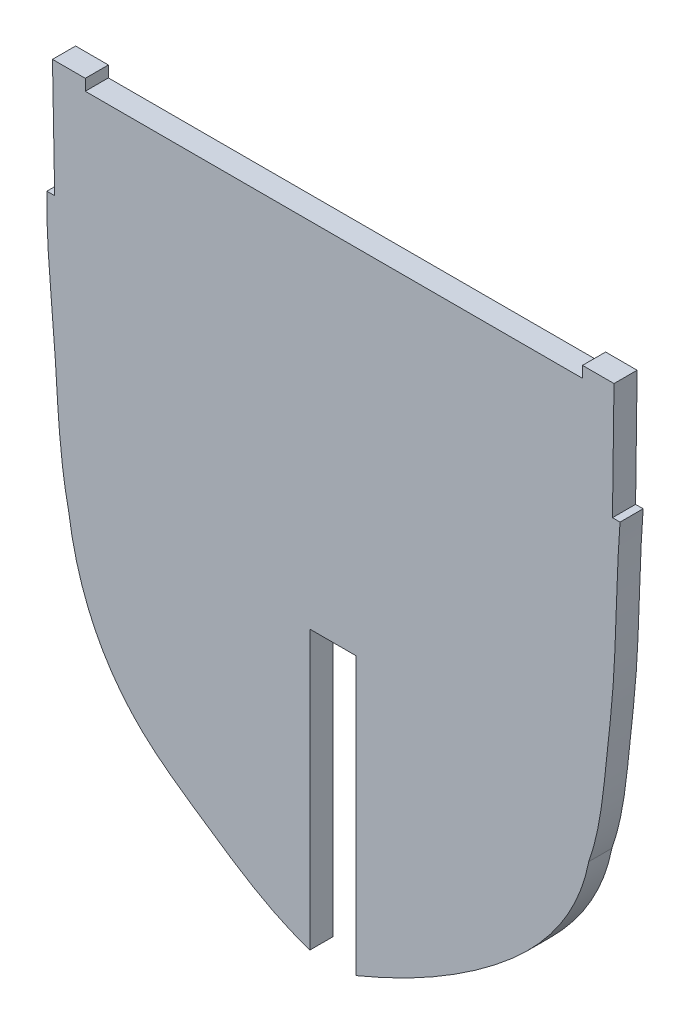
ISO-10303-21;
HEADER;
FILE_DESCRIPTION(('STEP AP214'),'2;1');
FILE_NAME('part.step','',(''),(''),'','','');
FILE_SCHEMA(('AUTOMOTIVE_DESIGN { 1 0 10303 214 1 1 1 1 }'));
ENDSEC;
DATA;
#1=APPLICATION_CONTEXT('core data for automotive mechanical design processes');
#2=APPLICATION_PROTOCOL_DEFINITION('international standard','automotive_design',2000,#1);
#3=PRODUCT_CONTEXT('',#1,'mechanical');
#4=PRODUCT('Part','Part','',(#3));
#5=PRODUCT_RELATED_PRODUCT_CATEGORY('part','',(#4));
#6=PRODUCT_DEFINITION_FORMATION('','',#4);
#7=PRODUCT_DEFINITION_CONTEXT('part definition',#1,'design');
#8=PRODUCT_DEFINITION('design','',#6,#7);
#9=PRODUCT_DEFINITION_SHAPE('','',#8);
#10=(LENGTH_UNIT() NAMED_UNIT(*) SI_UNIT(.MILLI.,.METRE.));
#11=(NAMED_UNIT(*) PLANE_ANGLE_UNIT() SI_UNIT($,.RADIAN.));
#12=(NAMED_UNIT(*) SI_UNIT($,.STERADIAN.) SOLID_ANGLE_UNIT());
#13=UNCERTAINTY_MEASURE_WITH_UNIT(LENGTH_MEASURE(1.E-05),#10,'distance_accuracy_value','');
#14=(GEOMETRIC_REPRESENTATION_CONTEXT(3) GLOBAL_UNCERTAINTY_ASSIGNED_CONTEXT((#13)) GLOBAL_UNIT_ASSIGNED_CONTEXT((#10,
#11,#12)) REPRESENTATION_CONTEXT('',''));
#15=CARTESIAN_POINT('',(0.,0.,0.));
#16=DIRECTION('',(0.,0.,1.));
#17=DIRECTION('',(1.,0.,0.));
#18=AXIS2_PLACEMENT_3D('',#15,#16,#17);
#19=CARTESIAN_POINT('',(244.559945218334,169.113949314404,4.));
#20=DIRECTION('',(1.,0.,0.));
#21=DIRECTION('',(0.,1.,0.));
#22=AXIS2_PLACEMENT_3D('',#19,#20,#21);
#23=PLANE('',#22);
#24=DIRECTION('',(0.,-1.,0.));
#25=VECTOR('',#24,1.);
#26=CARTESIAN_POINT('',(244.559945218334,169.113949314404,0.));
#27=LINE('',#26,#25);
#28=CARTESIAN_POINT('',(244.559945218334,173.113949314404,0.));
#29=VERTEX_POINT('',#28);
#30=CARTESIAN_POINT('',(244.559945218333,125.200650028839,0.));
#31=VERTEX_POINT('',#30);
#32=EDGE_CURVE('E116',#29,#31,#27,.T.);
#33=ORIENTED_EDGE('',*,*,#32,.T.);
#34=DIRECTION('',(0.,0.,-1.));
#35=VECTOR('',#34,1.);
#36=CARTESIAN_POINT('',(244.559945218333,125.200650028839,4.));
#37=LINE('',#36,#35);
#38=CARTESIAN_POINT('',(244.559945218333,125.200650028839,4.));
#39=VERTEX_POINT('',#38);
#40=EDGE_CURVE('E11',#39,#31,#37,.T.);
#41=ORIENTED_EDGE('',*,*,#40,.F.);
#42=DIRECTION('',(0.,-1.,0.));
#43=VECTOR('',#42,1.);
#44=CARTESIAN_POINT('',(244.559945218334,173.113949314404,4.));
#45=LINE('',#44,#43);
#46=CARTESIAN_POINT('',(244.559945218334,173.113949314404,4.));
#47=VERTEX_POINT('',#46);
#48=EDGE_CURVE('E122',#47,#39,#45,.T.);
#49=ORIENTED_EDGE('',*,*,#48,.F.);
#50=DIRECTION('',(0.,0.,-1.));
#51=VECTOR('',#50,1.);
#52=CARTESIAN_POINT('',(244.559945218334,173.113949314404,4.));
#53=LINE('',#52,#51);
#54=EDGE_CURVE('E181',#47,#29,#53,.T.);
#55=ORIENTED_EDGE('',*,*,#54,.T.);
#56=EDGE_LOOP('',(#33,#41,#49,#55));
#57=FACE_BOUND('',#56,.T.);
#58=ADVANCED_FACE('F41',(#57),#23,.F.);
#59=CARTESIAN_POINT('',(244.559945218333,125.200650028839,4.));
#60=CARTESIAN_POINT('',(246.510897062147,126.005562494782,4.));
#61=CARTESIAN_POINT('',(253.842274843694,129.235901905478,4.));
#62=CARTESIAN_POINT('',(270.285883987849,138.599536344276,4.));
#63=CARTESIAN_POINT('',(282.598559802234,151.178754354199,4.));
#64=CARTESIAN_POINT('',(284.799620171657,162.392429743791,4.));
#65=B_SPLINE_CURVE_WITH_KNOTS('',3,(#59,#60,#61,#62,#63,#64),.UNSPECIFIED.,.F.,.F.,(4,1,1,4),
(0.0301164069454703,0.13826450709615,0.441021692443392,1.),.UNSPECIFIED.);
#66=DIRECTION('',(0.,0.,-1.));
#67=VECTOR('',#66,1.);
#68=SURFACE_OF_LINEAR_EXTRUSION('',#65,#67);
#69=CARTESIAN_POINT('',(244.559945218333,125.200650028839,0.));
#70=CARTESIAN_POINT('',(246.510897062147,126.005562494782,0.));
#71=CARTESIAN_POINT('',(253.842274843694,129.235901905478,0.));
#72=CARTESIAN_POINT('',(270.285883987849,138.599536344276,0.));
#73=CARTESIAN_POINT('',(282.598559802234,151.178754354199,0.));
#74=CARTESIAN_POINT('',(284.799620171657,162.392429743791,0.));
#75=B_SPLINE_CURVE_WITH_KNOTS('',3,(#69,#70,#71,#72,#73,#74),.UNSPECIFIED.,.F.,.F.,(4,1,1,4),
(0.0301164069454703,0.13826450709615,0.441021692443392,1.),.UNSPECIFIED.);
#76=CARTESIAN_POINT('',(284.799620171657,162.392429743791,0.));
#77=VERTEX_POINT('',#76);
#78=EDGE_CURVE('E189',#31,#77,#75,.T.);
#79=ORIENTED_EDGE('',*,*,#78,.T.);
#80=DIRECTION('',(0.,0.,-1.));
#81=VECTOR('',#80,1.);
#82=CARTESIAN_POINT('',(284.799620171657,162.392429743791,4.));
#83=LINE('',#82,#81);
#84=CARTESIAN_POINT('',(284.799620171657,162.392429743791,4.));
#85=VERTEX_POINT('',#84);
#86=EDGE_CURVE('E49',#85,#77,#83,.T.);
#87=ORIENTED_EDGE('',*,*,#86,.F.);
#88=EDGE_CURVE('E363',#39,#85,#65,.T.);
#89=ORIENTED_EDGE('',*,*,#88,.F.);
#90=ORIENTED_EDGE('',*,*,#40,.T.);
#91=EDGE_LOOP('',(#79,#87,#89,#90));
#92=FACE_BOUND('',#91,.T.);
#93=ADVANCED_FACE('F358',(#92),#68,.F.);
#94=CARTESIAN_POINT('',(284.799620171657,162.392429743791,4.));
#95=CARTESIAN_POINT('',(286.75947484876,167.893462355419,4.));
#96=CARTESIAN_POINT('',(287.579939280225,177.029821997458,4.));
#97=CARTESIAN_POINT('',(289.649811573777,194.897723767174,4.));
#98=CARTESIAN_POINT('',(289.527393640036,207.1499427483,4.));
#99=CARTESIAN_POINT('',(290.208767160924,215.979752259991,4.));
#100=B_SPLINE_CURVE_WITH_KNOTS('',3,(#94,#95,#96,#97,#98,#99),.UNSPECIFIED.,.F.,.F.,(4,1,1,4),
(0.,0.321928335816744,0.507408204670779,1.),.UNSPECIFIED.);
#101=DIRECTION('',(0.,0.,-1.));
#102=VECTOR('',#101,1.);
#103=SURFACE_OF_LINEAR_EXTRUSION('',#100,#102);
#104=CARTESIAN_POINT('',(284.799620171657,162.392429743791,0.));
#105=CARTESIAN_POINT('',(286.75947484876,167.893462355419,0.));
#106=CARTESIAN_POINT('',(287.579939280225,177.029821997458,0.));
#107=CARTESIAN_POINT('',(289.649811573777,194.897723767174,0.));
#108=CARTESIAN_POINT('',(289.527393640036,207.1499427483,0.));
#109=CARTESIAN_POINT('',(290.208767160924,215.979752259991,0.));
#110=B_SPLINE_CURVE_WITH_KNOTS('',3,(#104,#105,#106,#107,#108,#109),.UNSPECIFIED.,.F.,.F.,(4,1,
1,4),(0.,0.321928335816744,0.507408204670779,1.),.UNSPECIFIED.);
#111=CARTESIAN_POINT('',(290.208767160924,215.979752259991,0.));
#112=VERTEX_POINT('',#111);
#113=EDGE_CURVE('E193',#77,#112,#110,.T.);
#114=ORIENTED_EDGE('',*,*,#113,.T.);
#115=DIRECTION('',(0.,0.,-1.));
#116=VECTOR('',#115,1.);
#117=CARTESIAN_POINT('',(290.208767160924,215.979752259991,4.));
#118=LINE('',#117,#116);
#119=CARTESIAN_POINT('',(290.208767160924,215.979752259991,4.));
#120=VERTEX_POINT('',#119);
#121=EDGE_CURVE('E268',#120,#112,#118,.T.);
#122=ORIENTED_EDGE('',*,*,#121,.F.);
#123=EDGE_CURVE('E277',#85,#120,#100,.T.);
#124=ORIENTED_EDGE('',*,*,#123,.F.);
#125=ORIENTED_EDGE('',*,*,#86,.T.);
#126=EDGE_LOOP('',(#114,#122,#124,#125));
#127=FACE_BOUND('',#126,.T.);
#128=ADVANCED_FACE('F275',(#127),#103,.F.);
#129=CARTESIAN_POINT('',(288.899951814838,215.979752259991,4.));
#130=DIRECTION('',(0.,-1.,0.));
#131=DIRECTION('',(0.,0.,-1.));
#132=AXIS2_PLACEMENT_3D('',#129,#130,#131);
#133=PLANE('',#132);
#134=DIRECTION('',(-1.,0.,0.));
#135=VECTOR('',#134,1.);
#136=CARTESIAN_POINT('',(288.899951814838,215.979752259991,0.));
#137=LINE('',#136,#135);
#138=CARTESIAN_POINT('',(288.899951814838,215.979752259991,0.));
#139=VERTEX_POINT('',#138);
#140=EDGE_CURVE('E200',#112,#139,#137,.T.);
#141=ORIENTED_EDGE('',*,*,#140,.T.);
#142=DIRECTION('',(0.,0.,-1.));
#143=VECTOR('',#142,1.);
#144=CARTESIAN_POINT('',(288.899951814838,215.979752259991,4.));
#145=LINE('',#144,#143);
#146=CARTESIAN_POINT('',(288.899951814838,215.979752259991,4.));
#147=VERTEX_POINT('',#146);
#148=EDGE_CURVE('E265',#147,#139,#145,.T.);
#149=ORIENTED_EDGE('',*,*,#148,.F.);
#150=DIRECTION('',(-1.,0.,0.));
#151=VECTOR('',#150,1.);
#152=CARTESIAN_POINT('',(288.899951814838,215.979752259991,4.));
#153=LINE('',#152,#151);
#154=EDGE_CURVE('E295',#120,#147,#153,.T.);
#155=ORIENTED_EDGE('',*,*,#154,.F.);
#156=ORIENTED_EDGE('',*,*,#121,.T.);
#157=EDGE_LOOP('',(#141,#149,#155,#156));
#158=FACE_BOUND('',#157,.T.);
#159=ADVANCED_FACE('F286',(#158),#133,.F.);
#160=CARTESIAN_POINT('',(289.166488449768,236.215172683287,4.));
#161=DIRECTION('',(-0.999913263308092,0.0131706438932042,0.));
#162=DIRECTION('',(-0.0131706438932042,-0.999913263308092,0.));
#163=AXIS2_PLACEMENT_3D('',#160,#161,#162);
#164=PLANE('',#163);
#165=DIRECTION('',(0.0131706438932042,0.999913263308092,0.));
#166=VECTOR('',#165,1.);
#167=CARTESIAN_POINT('',(289.166488449768,236.215172683287,0.));
#168=LINE('',#167,#166);
#169=CARTESIAN_POINT('',(289.166488449768,236.215172683287,0.));
#170=VERTEX_POINT('',#169);
#171=EDGE_CURVE('E205',#139,#170,#168,.T.);
#172=ORIENTED_EDGE('',*,*,#171,.T.);
#173=DIRECTION('',(0.,0.,-1.));
#174=VECTOR('',#173,1.);
#175=CARTESIAN_POINT('',(289.166488449768,236.215172683287,4.));
#176=LINE('',#175,#174);
#177=CARTESIAN_POINT('',(289.166488449768,236.215172683287,4.));
#178=VERTEX_POINT('',#177);
#179=EDGE_CURVE('E262',#178,#170,#176,.T.);
#180=ORIENTED_EDGE('',*,*,#179,.F.);
#181=DIRECTION('',(0.0131706438932042,0.999913263308092,0.));
#182=VECTOR('',#181,1.);
#183=CARTESIAN_POINT('',(289.166488449768,236.215172683287,4.));
#184=LINE('',#183,#182);
#185=EDGE_CURVE('E292',#147,#178,#184,.T.);
#186=ORIENTED_EDGE('',*,*,#185,.F.);
#187=ORIENTED_EDGE('',*,*,#148,.T.);
#188=EDGE_LOOP('',(#172,#180,#186,#187));
#189=FACE_BOUND('',#188,.T.);
#190=ADVANCED_FACE('F290',(#189),#164,.F.);
#191=CARTESIAN_POINT('',(283.716181533606,236.215172683287,4.));
#192=DIRECTION('',(0.,-1.,0.));
#193=DIRECTION('',(0.,0.,-1.));
#194=AXIS2_PLACEMENT_3D('',#191,#192,#193);
#195=PLANE('',#194);
#196=DIRECTION('',(-1.,0.,0.));
#197=VECTOR('',#196,1.);
#198=CARTESIAN_POINT('',(283.716181533606,236.215172683287,0.));
#199=LINE('',#198,#197);
#200=CARTESIAN_POINT('',(283.716181533606,236.215172683287,0.));
#201=VERTEX_POINT('',#200);
#202=EDGE_CURVE('E207',#170,#201,#199,.T.);
#203=ORIENTED_EDGE('',*,*,#202,.T.);
#204=DIRECTION('',(0.,0.,-1.));
#205=VECTOR('',#204,1.);
#206=CARTESIAN_POINT('',(283.716181533606,236.215172683287,4.));
#207=LINE('',#206,#205);
#208=CARTESIAN_POINT('',(283.716181533606,236.215172683287,4.));
#209=VERTEX_POINT('',#208);
#210=EDGE_CURVE('E259',#209,#201,#207,.T.);
#211=ORIENTED_EDGE('',*,*,#210,.F.);
#212=DIRECTION('',(-1.,0.,0.));
#213=VECTOR('',#212,1.);
#214=CARTESIAN_POINT('',(283.716181533606,236.215172683287,4.));
#215=LINE('',#214,#213);
#216=EDGE_CURVE('E294',#178,#209,#215,.T.);
#217=ORIENTED_EDGE('',*,*,#216,.F.);
#218=ORIENTED_EDGE('',*,*,#179,.T.);
#219=EDGE_LOOP('',(#203,#211,#217,#218));
#220=FACE_BOUND('',#219,.T.);
#221=ADVANCED_FACE('F348',(#220),#195,.F.);
#222=CARTESIAN_POINT('',(283.716181533606,234.272114967853,4.));
#223=DIRECTION('',(1.,0.,0.));
#224=DIRECTION('',(0.,0.,-1.));
#225=AXIS2_PLACEMENT_3D('',#222,#223,#224);
#226=PLANE('',#225);
#227=DIRECTION('',(0.,-1.,0.));
#228=VECTOR('',#227,1.);
#229=CARTESIAN_POINT('',(283.716181533606,234.272114967853,0.));
#230=LINE('',#229,#228);
#231=CARTESIAN_POINT('',(283.716181533606,234.272114967853,0.));
#232=VERTEX_POINT('',#231);
#233=EDGE_CURVE('E209',#201,#232,#230,.T.);
#234=ORIENTED_EDGE('',*,*,#233,.T.);
#235=DIRECTION('',(0.,0.,-1.));
#236=VECTOR('',#235,1.);
#237=CARTESIAN_POINT('',(283.716181533606,234.272114967853,4.));
#238=LINE('',#237,#236);
#239=CARTESIAN_POINT('',(283.716181533606,234.272114967853,4.));
#240=VERTEX_POINT('',#239);
#241=EDGE_CURVE('E256',#240,#232,#238,.T.);
#242=ORIENTED_EDGE('',*,*,#241,.F.);
#243=DIRECTION('',(0.,-1.,0.));
#244=VECTOR('',#243,1.);
#245=CARTESIAN_POINT('',(283.716181533606,234.272114967853,4.));
#246=LINE('',#245,#244);
#247=EDGE_CURVE('E297',#209,#240,#246,.T.);
#248=ORIENTED_EDGE('',*,*,#247,.F.);
#249=ORIENTED_EDGE('',*,*,#210,.T.);
#250=EDGE_LOOP('',(#234,#242,#248,#249));
#251=FACE_BOUND('',#250,.T.);
#252=ADVANCED_FACE('F344',(#251),#226,.F.);
#253=CARTESIAN_POINT('',(197.691755822406,234.272114967853,4.));
#254=DIRECTION('',(0.,-1.,0.));
#255=DIRECTION('',(0.,0.,-1.));
#256=AXIS2_PLACEMENT_3D('',#253,#254,#255);
#257=PLANE('',#256);
#258=DIRECTION('',(-1.,0.,0.));
#259=VECTOR('',#258,1.);
#260=CARTESIAN_POINT('',(197.691755822406,234.272114967853,0.));
#261=LINE('',#260,#259);
#262=CARTESIAN_POINT('',(197.691755822406,234.272114967853,0.));
#263=VERTEX_POINT('',#262);
#264=EDGE_CURVE('E211',#232,#263,#261,.T.);
#265=ORIENTED_EDGE('',*,*,#264,.T.);
#266=DIRECTION('',(0.,0.,-1.));
#267=VECTOR('',#266,1.);
#268=CARTESIAN_POINT('',(197.691755822406,234.272114967853,4.));
#269=LINE('',#268,#267);
#270=CARTESIAN_POINT('',(197.691755822406,234.272114967853,4.));
#271=VERTEX_POINT('',#270);
#272=EDGE_CURVE('E253',#271,#263,#269,.T.);
#273=ORIENTED_EDGE('',*,*,#272,.F.);
#274=DIRECTION('',(-1.,0.,0.));
#275=VECTOR('',#274,1.);
#276=CARTESIAN_POINT('',(197.691755822406,234.272114967853,4.));
#277=LINE('',#276,#275);
#278=EDGE_CURVE('E303',#240,#271,#277,.T.);
#279=ORIENTED_EDGE('',*,*,#278,.F.);
#280=ORIENTED_EDGE('',*,*,#241,.T.);
#281=EDGE_LOOP('',(#265,#273,#279,#280));
#282=FACE_BOUND('',#281,.T.);
#283=ADVANCED_FACE('F340',(#282),#257,.F.);
#284=CARTESIAN_POINT('',(197.691755822406,236.215172683287,4.));
#285=DIRECTION('',(-1.,0.,0.));
#286=DIRECTION('',(0.,0.,1.));
#287=AXIS2_PLACEMENT_3D('',#284,#285,#286);
#288=PLANE('',#287);
#289=DIRECTION('',(0.,1.,0.));
#290=VECTOR('',#289,1.);
#291=CARTESIAN_POINT('',(197.691755822406,236.215172683287,0.));
#292=LINE('',#291,#290);
#293=CARTESIAN_POINT('',(197.691755822406,236.215172683287,0.));
#294=VERTEX_POINT('',#293);
#295=EDGE_CURVE('E213',#263,#294,#292,.T.);
#296=ORIENTED_EDGE('',*,*,#295,.T.);
#297=DIRECTION('',(0.,0.,-1.));
#298=VECTOR('',#297,1.);
#299=CARTESIAN_POINT('',(197.691755822406,236.215172683287,4.));
#300=LINE('',#299,#298);
#301=CARTESIAN_POINT('',(197.691755822406,236.215172683287,4.));
#302=VERTEX_POINT('',#301);
#303=EDGE_CURVE('E250',#302,#294,#300,.T.);
#304=ORIENTED_EDGE('',*,*,#303,.F.);
#305=DIRECTION('',(0.,1.,0.));
#306=VECTOR('',#305,1.);
#307=CARTESIAN_POINT('',(197.691755822406,236.215172683287,4.));
#308=LINE('',#307,#306);
#309=EDGE_CURVE('E305',#271,#302,#308,.T.);
#310=ORIENTED_EDGE('',*,*,#309,.F.);
#311=ORIENTED_EDGE('',*,*,#272,.T.);
#312=EDGE_LOOP('',(#296,#304,#310,#311));
#313=FACE_BOUND('',#312,.T.);
#314=ADVANCED_FACE('F336',(#313),#288,.F.);
#315=CARTESIAN_POINT('',(192.015709029753,236.215172683287,4.));
#316=DIRECTION('',(0.,-1.,0.));
#317=DIRECTION('',(0.,0.,-1.));
#318=AXIS2_PLACEMENT_3D('',#315,#316,#317);
#319=PLANE('',#318);
#320=DIRECTION('',(-1.,0.,0.));
#321=VECTOR('',#320,1.);
#322=CARTESIAN_POINT('',(192.015709029753,236.215172683287,0.));
#323=LINE('',#322,#321);
#324=CARTESIAN_POINT('',(192.015709029753,236.215172683287,0.));
#325=VERTEX_POINT('',#324);
#326=EDGE_CURVE('E215',#294,#325,#323,.T.);
#327=ORIENTED_EDGE('',*,*,#326,.T.);
#328=DIRECTION('',(0.,0.,-1.));
#329=VECTOR('',#328,1.);
#330=CARTESIAN_POINT('',(192.015709029753,236.215172683287,4.));
#331=LINE('',#330,#329);
#332=CARTESIAN_POINT('',(192.015709029753,236.215172683287,4.));
#333=VERTEX_POINT('',#332);
#334=EDGE_CURVE('E247',#333,#325,#331,.T.);
#335=ORIENTED_EDGE('',*,*,#334,.F.);
#336=DIRECTION('',(-1.,0.,0.));
#337=VECTOR('',#336,1.);
#338=CARTESIAN_POINT('',(192.015709029753,236.215172683287,4.));
#339=LINE('',#338,#337);
#340=EDGE_CURVE('E307',#302,#333,#339,.T.);
#341=ORIENTED_EDGE('',*,*,#340,.F.);
#342=ORIENTED_EDGE('',*,*,#303,.T.);
#343=EDGE_LOOP('',(#327,#335,#341,#342));
#344=FACE_BOUND('',#343,.T.);
#345=ADVANCED_FACE('F332',(#344),#319,.F.);
#346=CARTESIAN_POINT('',(192.015709029753,236.215172683287,4.));
#347=DIRECTION('',(0.999822282401947,0.0188521514040619,0.));
#348=DIRECTION('',(-0.0188521514040619,0.999822282401947,0.));
#349=AXIS2_PLACEMENT_3D('',#346,#347,#348);
#350=PLANE('',#349);
#351=DIRECTION('',(0.0188521514040619,-0.999822282401947,0.));
#352=VECTOR('',#351,1.);
#353=CARTESIAN_POINT('',(192.015709029753,236.215172683287,0.));
#354=LINE('',#353,#352);
#355=CARTESIAN_POINT('',(192.397258047273,215.979752259991,0.));
#356=VERTEX_POINT('',#355);
#357=EDGE_CURVE('E217',#325,#356,#354,.T.);
#358=ORIENTED_EDGE('',*,*,#357,.T.);
#359=DIRECTION('',(0.,0.,-1.));
#360=VECTOR('',#359,1.);
#361=CARTESIAN_POINT('',(192.397258047273,215.979752259991,4.));
#362=LINE('',#361,#360);
#363=CARTESIAN_POINT('',(192.397258047273,215.979752259991,4.));
#364=VERTEX_POINT('',#363);
#365=EDGE_CURVE('E244',#364,#356,#362,.T.);
#366=ORIENTED_EDGE('',*,*,#365,.F.);
#367=DIRECTION('',(0.0188521514040619,-0.999822282401947,0.));
#368=VECTOR('',#367,1.);
#369=CARTESIAN_POINT('',(192.015709029753,236.215172683287,4.));
#370=LINE('',#369,#368);
#371=EDGE_CURVE('E309',#333,#364,#370,.T.);
#372=ORIENTED_EDGE('',*,*,#371,.F.);
#373=ORIENTED_EDGE('',*,*,#334,.T.);
#374=EDGE_LOOP('',(#358,#366,#372,#373));
#375=FACE_BOUND('',#374,.T.);
#376=ADVANCED_FACE('F328',(#375),#350,.F.);
#377=CARTESIAN_POINT('',(192.397258047273,215.979752259991,4.));
#378=DIRECTION('',(0.,-1.,0.));
#379=DIRECTION('',(0.,0.,-1.));
#380=AXIS2_PLACEMENT_3D('',#377,#378,#379);
#381=PLANE('',#380);
#382=DIRECTION('',(-1.,0.,0.));
#383=VECTOR('',#382,1.);
#384=CARTESIAN_POINT('',(192.397258047273,215.979752259991,0.));
#385=LINE('',#384,#383);
#386=CARTESIAN_POINT('',(191.044749595019,215.979752259991,0.));
#387=VERTEX_POINT('',#386);
#388=EDGE_CURVE('E219',#356,#387,#385,.T.);
#389=ORIENTED_EDGE('',*,*,#388,.T.);
#390=DIRECTION('',(0.,0.,-1.));
#391=VECTOR('',#390,1.);
#392=CARTESIAN_POINT('',(191.044749595019,215.979752259991,4.));
#393=LINE('',#392,#391);
#394=CARTESIAN_POINT('',(191.044749595019,215.979752259991,4.));
#395=VERTEX_POINT('',#394);
#396=EDGE_CURVE('E241',#395,#387,#393,.T.);
#397=ORIENTED_EDGE('',*,*,#396,.F.);
#398=DIRECTION('',(-1.,0.,0.));
#399=VECTOR('',#398,1.);
#400=CARTESIAN_POINT('',(192.397258047273,215.979752259991,4.));
#401=LINE('',#400,#399);
#402=EDGE_CURVE('E311',#364,#395,#401,.T.);
#403=ORIENTED_EDGE('',*,*,#402,.F.);
#404=ORIENTED_EDGE('',*,*,#365,.T.);
#405=EDGE_LOOP('',(#389,#397,#403,#404));
#406=FACE_BOUND('',#405,.T.);
#407=ADVANCED_FACE('F323',(#406),#381,.F.);
#408=CARTESIAN_POINT('',(191.044749595019,215.979752259991,4.));
#409=CARTESIAN_POINT('',(190.906681756805,208.303976986242,4.));
#410=CARTESIAN_POINT('',(192.789425639078,192.980779400191,4.));
#411=CARTESIAN_POINT('',(193.135017556469,177.533691325746,4.));
#412=CARTESIAN_POINT('',(194.814526020703,169.905399037579,4.));
#413=B_SPLINE_CURVE_WITH_KNOTS('',3,(#408,#409,#410,#411,#412),.UNSPECIFIED.,.F.,.F.,(4,1,4),
(0.,0.496472491570369,1.),.UNSPECIFIED.);
#414=DIRECTION('',(0.,0.,-1.));
#415=VECTOR('',#414,1.);
#416=SURFACE_OF_LINEAR_EXTRUSION('',#413,#415);
#417=CARTESIAN_POINT('',(191.044749595019,215.979752259991,0.));
#418=CARTESIAN_POINT('',(190.906681756805,208.303976986242,0.));
#419=CARTESIAN_POINT('',(192.789425639078,192.980779400191,0.));
#420=CARTESIAN_POINT('',(193.135017556469,177.533691325746,0.));
#421=CARTESIAN_POINT('',(194.814526020703,169.905399037579,0.));
#422=B_SPLINE_CURVE_WITH_KNOTS('',3,(#417,#418,#419,#420,#421),.UNSPECIFIED.,.F.,.F.,(4,1,4),
(0.,0.496472491570369,1.),.UNSPECIFIED.);
#423=CARTESIAN_POINT('',(194.814526020703,169.905399037579,0.));
#424=VERTEX_POINT('',#423);
#425=EDGE_CURVE('E221',#387,#424,#422,.T.);
#426=ORIENTED_EDGE('',*,*,#425,.T.);
#427=DIRECTION('',(0.,0.,-1.));
#428=VECTOR('',#427,1.);
#429=CARTESIAN_POINT('',(194.814526020703,169.905399037579,4.));
#430=LINE('',#429,#428);
#431=CARTESIAN_POINT('',(194.814526020703,169.905399037579,4.));
#432=VERTEX_POINT('',#431);
#433=EDGE_CURVE('E176',#432,#424,#430,.T.);
#434=ORIENTED_EDGE('',*,*,#433,.F.);
#435=EDGE_CURVE('E166',#395,#432,#413,.T.);
#436=ORIENTED_EDGE('',*,*,#435,.F.);
#437=ORIENTED_EDGE('',*,*,#396,.T.);
#438=EDGE_LOOP('',(#426,#434,#436,#437));
#439=FACE_BOUND('',#438,.T.);
#440=ADVANCED_FACE('F319',(#439),#416,.F.);
#441=CARTESIAN_POINT('',(194.814526020703,169.905399037579,4.));
#442=CARTESIAN_POINT('',(195.610141371411,164.176898926876,4.));
#443=CARTESIAN_POINT('',(198.346571660698,154.492253983675,4.));
#444=CARTESIAN_POINT('',(207.021687023467,142.787448401744,4.));
#445=CARTESIAN_POINT('',(216.390436056588,136.399663861222,4.));
#446=CARTESIAN_POINT('',(225.951903336942,129.821011624397,4.));
#447=CARTESIAN_POINT('',(232.27111431126,126.43248459602,4.));
#448=CARTESIAN_POINT('',(236.559945217192,125.032675043897,4.));
#449=B_SPLINE_CURVE_WITH_KNOTS('',3,(#441,#442,#443,#444,#445,#446,#447,#448),.UNSPECIFIED.,.F.,
.F.,(4,1,1,1,1,4),(0.,0.262954959263129,0.44838947852888,0.647828964952025,0.773904026379694,
0.97478500107811),.UNSPECIFIED.);
#450=DIRECTION('',(0.,0.,-1.));
#451=VECTOR('',#450,1.);
#452=SURFACE_OF_LINEAR_EXTRUSION('',#449,#451);
#453=CARTESIAN_POINT('',(194.814526020703,169.905399037579,0.));
#454=CARTESIAN_POINT('',(195.610141371411,164.176898926876,0.));
#455=CARTESIAN_POINT('',(198.346571660698,154.492253983675,0.));
#456=CARTESIAN_POINT('',(207.021687023467,142.787448401744,0.));
#457=CARTESIAN_POINT('',(216.390436056588,136.399663861222,0.));
#458=CARTESIAN_POINT('',(225.951903336942,129.821011624397,0.));
#459=CARTESIAN_POINT('',(232.27111431126,126.43248459602,0.));
#460=CARTESIAN_POINT('',(236.559945217192,125.032675043897,0.));
#461=B_SPLINE_CURVE_WITH_KNOTS('',3,(#453,#454,#455,#456,#457,#458,#459,#460),.UNSPECIFIED.,.F.,
.F.,(4,1,1,1,1,4),(0.,0.262954959263129,0.44838947852888,0.647828964952025,0.773904026379694,
0.97478500107811),.UNSPECIFIED.);
#462=CARTESIAN_POINT('',(236.559945217192,125.032675043897,0.));
#463=VERTEX_POINT('',#462);
#464=EDGE_CURVE('E175',#424,#463,#461,.T.);
#465=ORIENTED_EDGE('',*,*,#464,.T.);
#466=DIRECTION('',(0.,0.,-1.));
#467=VECTOR('',#466,1.);
#468=CARTESIAN_POINT('',(236.559945217192,125.032675043897,4.));
#469=LINE('',#468,#467);
#470=CARTESIAN_POINT('',(236.559945217192,125.032675043897,4.));
#471=VERTEX_POINT('',#470);
#472=EDGE_CURVE('E172',#471,#463,#469,.T.);
#473=ORIENTED_EDGE('',*,*,#472,.F.);
#474=EDGE_CURVE('E160',#432,#471,#449,.T.);
#475=ORIENTED_EDGE('',*,*,#474,.F.);
#476=ORIENTED_EDGE('',*,*,#433,.T.);
#477=EDGE_LOOP('',(#465,#473,#475,#476));
#478=FACE_BOUND('',#477,.T.);
#479=ADVANCED_FACE('F173',(#478),#452,.F.);
#480=CARTESIAN_POINT('',(236.559945217192,169.113949314404,4.));
#481=DIRECTION('',(-1.,0.,0.));
#482=DIRECTION('',(0.,0.,1.));
#483=AXIS2_PLACEMENT_3D('',#480,#481,#482);
#484=PLANE('',#483);
#485=DIRECTION('',(0.,1.,0.));
#486=VECTOR('',#485,1.);
#487=CARTESIAN_POINT('',(236.559945217192,169.113949314404,0.));
#488=LINE('',#487,#486);
#489=CARTESIAN_POINT('',(236.559945217192,173.113949314404,0.));
#490=VERTEX_POINT('',#489);
#491=EDGE_CURVE('E109',#463,#490,#488,.T.);
#492=ORIENTED_EDGE('',*,*,#491,.T.);
#493=DIRECTION('',(0.,0.,-1.));
#494=VECTOR('',#493,1.);
#495=CARTESIAN_POINT('',(236.559945217192,173.113949314404,4.));
#496=LINE('',#495,#494);
#497=CARTESIAN_POINT('',(236.559945217192,173.113949314404,4.));
#498=VERTEX_POINT('',#497);
#499=EDGE_CURVE('E177',#498,#490,#496,.T.);
#500=ORIENTED_EDGE('',*,*,#499,.F.);
#501=DIRECTION('',(0.,1.,0.));
#502=VECTOR('',#501,1.);
#503=CARTESIAN_POINT('',(236.559945217192,169.113949314404,4.));
#504=LINE('',#503,#502);
#505=EDGE_CURVE('E164',#471,#498,#504,.T.);
#506=ORIENTED_EDGE('',*,*,#505,.F.);
#507=ORIENTED_EDGE('',*,*,#472,.T.);
#508=EDGE_LOOP('',(#492,#500,#506,#507));
#509=FACE_BOUND('',#508,.T.);
#510=ADVANCED_FACE('F179',(#509),#484,.F.);
#511=CARTESIAN_POINT('',(236.559945217192,173.113949314404,4.));
#512=DIRECTION('',(0.,1.,0.));
#513=DIRECTION('',(0.,0.,1.));
#514=AXIS2_PLACEMENT_3D('',#511,#512,#513);
#515=PLANE('',#514);
#516=DIRECTION('',(1.,0.,0.));
#517=VECTOR('',#516,1.);
#518=CARTESIAN_POINT('',(236.559945217192,173.113949314404,0.));
#519=LINE('',#518,#517);
#520=EDGE_CURVE('E235',#490,#29,#519,.T.);
#521=ORIENTED_EDGE('',*,*,#520,.T.);
#522=ORIENTED_EDGE('',*,*,#54,.F.);
#523=DIRECTION('',(1.,0.,0.));
#524=VECTOR('',#523,1.);
#525=CARTESIAN_POINT('',(236.559945217192,173.113949314404,4.));
#526=LINE('',#525,#524);
#527=EDGE_CURVE('E57',#498,#47,#526,.T.);
#528=ORIENTED_EDGE('',*,*,#527,.F.);
#529=ORIENTED_EDGE('',*,*,#499,.T.);
#530=EDGE_LOOP('',(#521,#522,#528,#529));
#531=FACE_BOUND('',#530,.T.);
#532=ADVANCED_FACE('F376',(#531),#515,.F.);
#533=CARTESIAN_POINT('',(269.15386149845,139.279004566063,4.));
#534=DIRECTION('',(0.,0.,-1.));
#535=DIRECTION('',(-1.,0.,0.));
#536=AXIS2_PLACEMENT_3D('',#533,#534,#535);
#537=PLANE('',#536);
#538=ORIENTED_EDGE('',*,*,#48,.T.);
#539=ORIENTED_EDGE('',*,*,#88,.T.);
#540=ORIENTED_EDGE('',*,*,#123,.T.);
#541=ORIENTED_EDGE('',*,*,#154,.T.);
#542=ORIENTED_EDGE('',*,*,#185,.T.);
#543=ORIENTED_EDGE('',*,*,#216,.T.);
#544=ORIENTED_EDGE('',*,*,#247,.T.);
#545=ORIENTED_EDGE('',*,*,#278,.T.);
#546=ORIENTED_EDGE('',*,*,#309,.T.);
#547=ORIENTED_EDGE('',*,*,#340,.T.);
#548=ORIENTED_EDGE('',*,*,#371,.T.);
#549=ORIENTED_EDGE('',*,*,#402,.T.);
#550=ORIENTED_EDGE('',*,*,#435,.T.);
#551=ORIENTED_EDGE('',*,*,#474,.T.);
#552=ORIENTED_EDGE('',*,*,#505,.T.);
#553=ORIENTED_EDGE('',*,*,#527,.T.);
#554=EDGE_LOOP('',(#538,#539,#540,#541,#542,#543,#544,#545,#546,#547,#548,#549,#550,#551,#552,#553));
#555=FACE_BOUND('',#554,.T.);
#556=ADVANCED_FACE('F162',(#555),#537,.F.);
#557=CARTESIAN_POINT('',(269.15386149845,139.279004566063,0.));
#558=DIRECTION('',(0.,0.,-1.));
#559=DIRECTION('',(-1.,0.,0.));
#560=AXIS2_PLACEMENT_3D('',#557,#558,#559);
#561=PLANE('',#560);
#562=ORIENTED_EDGE('',*,*,#32,.F.);
#563=ORIENTED_EDGE('',*,*,#520,.F.);
#564=ORIENTED_EDGE('',*,*,#491,.F.);
#565=ORIENTED_EDGE('',*,*,#464,.F.);
#566=ORIENTED_EDGE('',*,*,#425,.F.);
#567=ORIENTED_EDGE('',*,*,#388,.F.);
#568=ORIENTED_EDGE('',*,*,#357,.F.);
#569=ORIENTED_EDGE('',*,*,#326,.F.);
#570=ORIENTED_EDGE('',*,*,#295,.F.);
#571=ORIENTED_EDGE('',*,*,#264,.F.);
#572=ORIENTED_EDGE('',*,*,#233,.F.);
#573=ORIENTED_EDGE('',*,*,#202,.F.);
#574=ORIENTED_EDGE('',*,*,#171,.F.);
#575=ORIENTED_EDGE('',*,*,#140,.F.);
#576=ORIENTED_EDGE('',*,*,#113,.F.);
#577=ORIENTED_EDGE('',*,*,#78,.F.);
#578=EDGE_LOOP('',(#562,#563,#564,#565,#566,#567,#568,#569,#570,#571,#572,#573,#574,#575,#576,#577));
#579=FACE_BOUND('',#578,.T.);
#580=ADVANCED_FACE('F281',(#579),#561,.T.);
#581=CLOSED_SHELL('',(#58,#93,#128,#159,#190,#221,#252,#283,#314,#345,#376,#407,#440,#479,#510,
#532,#556,#580));
#582=MANIFOLD_SOLID_BREP('B2',#581);
#583=ADVANCED_BREP_SHAPE_REPRESENTATION('',(#18,#582),#14);
#584=SHAPE_DEFINITION_REPRESENTATION(#9,#583);
ENDSEC;
END-ISO-10303-21;
